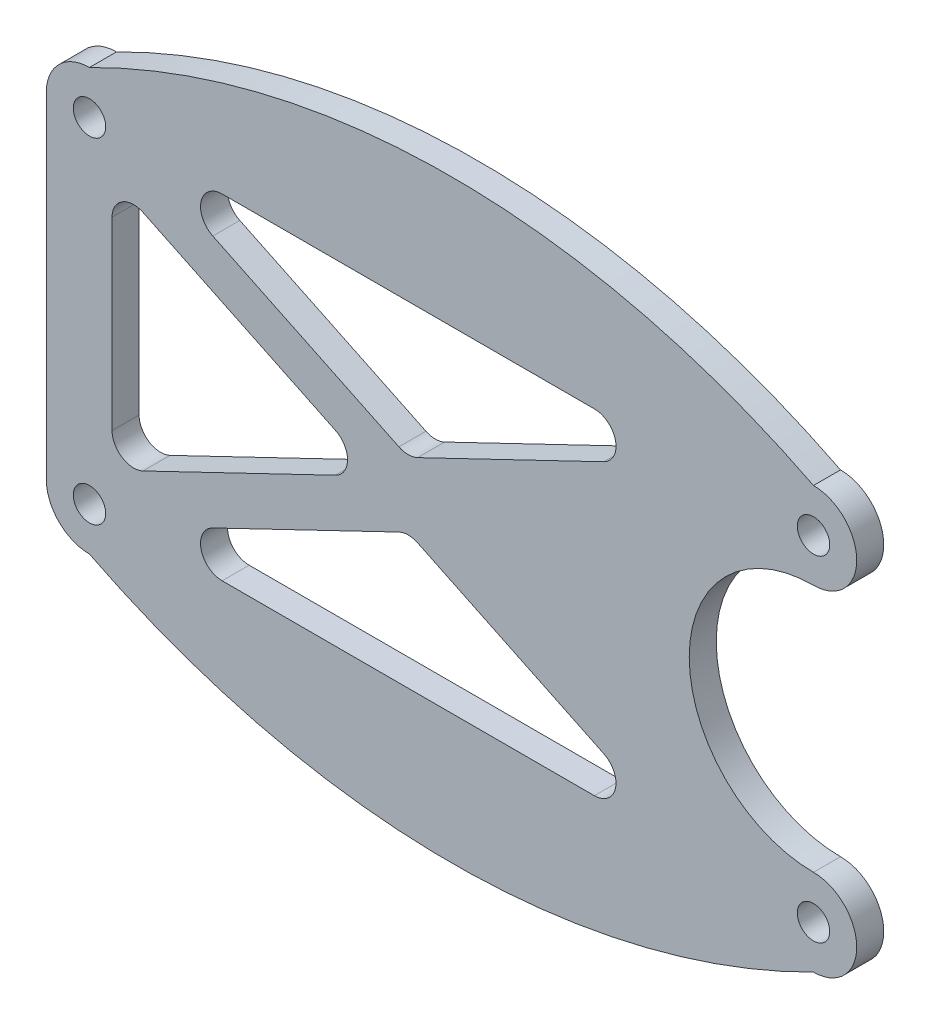
ISO-10303-21;
HEADER;
FILE_DESCRIPTION(('STEP AP214'),'2;1');
FILE_NAME('part.step','',(''),(''),'','','');
FILE_SCHEMA(('AUTOMOTIVE_DESIGN { 1 0 10303 214 1 1 1 1 }'));
ENDSEC;
DATA;
#1=APPLICATION_CONTEXT('core data for automotive mechanical design processes');
#2=APPLICATION_PROTOCOL_DEFINITION('international standard','automotive_design',2000,#1);
#3=PRODUCT_CONTEXT('',#1,'mechanical');
#4=PRODUCT('Part','Part','',(#3));
#5=PRODUCT_RELATED_PRODUCT_CATEGORY('part','',(#4));
#6=PRODUCT_DEFINITION_FORMATION('','',#4);
#7=PRODUCT_DEFINITION_CONTEXT('part definition',#1,'design');
#8=PRODUCT_DEFINITION('design','',#6,#7);
#9=PRODUCT_DEFINITION_SHAPE('','',#8);
#10=(LENGTH_UNIT() NAMED_UNIT(*) SI_UNIT(.MILLI.,.METRE.));
#11=(NAMED_UNIT(*) PLANE_ANGLE_UNIT() SI_UNIT($,.RADIAN.));
#12=(NAMED_UNIT(*) SI_UNIT($,.STERADIAN.) SOLID_ANGLE_UNIT());
#13=UNCERTAINTY_MEASURE_WITH_UNIT(LENGTH_MEASURE(1.E-05),#10,'distance_accuracy_value','');
#14=(GEOMETRIC_REPRESENTATION_CONTEXT(3) GLOBAL_UNCERTAINTY_ASSIGNED_CONTEXT((#13)) GLOBAL_UNIT_ASSIGNED_CONTEXT((#10,
#11,#12)) REPRESENTATION_CONTEXT('',''));
#15=CARTESIAN_POINT('',(0.,0.,0.));
#16=DIRECTION('',(0.,0.,1.));
#17=DIRECTION('',(1.,0.,0.));
#18=AXIS2_PLACEMENT_3D('',#15,#16,#17);
#19=CARTESIAN_POINT('',(-97.318076,15.5,2.5));
#20=DIRECTION('',(0.,0.,1.));
#21=DIRECTION('',(1.,0.,0.));
#22=AXIS2_PLACEMENT_3D('',#19,#20,#21);
#23=PLANE('',#22);
#24=DIRECTION('',(-0.901252424525187,0.433294434867877,0.));
#25=VECTOR('',#24,1.);
#26=CARTESIAN_POINT('',(-67.818076,-3.,2.5));
#27=LINE('',#26,#25);
#28=CARTESIAN_POINT('',(-49.7272860860248,-11.6974951509496,2.5));
#29=VERTEX_POINT('',#28);
#30=CARTESIAN_POINT('',(-66.9514871302643,-3.41662926429604,2.5));
#31=VERTEX_POINT('',#30);
#32=EDGE_CURVE('E360',#29,#31,#27,.T.);
#33=ORIENTED_EDGE('',*,*,#32,.F.);
#34=CARTESIAN_POINT('',(-50.5938749557605,-13.5,2.5));
#35=DIRECTION('',(0.,0.,1.));
#36=DIRECTION('',(1.,0.,0.));
#37=AXIS2_PLACEMENT_3D('',#34,#35,#36);
#38=CIRCLE('',#37,2.);
#39=CARTESIAN_POINT('',(-50.5938749557605,-15.5,2.5));
#40=VERTEX_POINT('',#39);
#41=EDGE_CURVE('E325',#29,#40,#38,.F.);
#42=ORIENTED_EDGE('',*,*,#41,.T.);
#43=DIRECTION('',(1.,0.,0.));
#44=VECTOR('',#43,1.);
#45=CARTESIAN_POINT('',(-41.818076,-15.5,2.5));
#46=LINE('',#45,#44);
#47=CARTESIAN_POINT('',(-85.0422770442395,-15.5,2.5));
#48=VERTEX_POINT('',#47);
#49=EDGE_CURVE('E378',#48,#40,#46,.T.);
#50=ORIENTED_EDGE('',*,*,#49,.F.);
#51=CARTESIAN_POINT('',(-85.0422770442395,-13.5,2.5));
#52=DIRECTION('',(0.,0.,1.));
#53=DIRECTION('',(1.,0.,0.));
#54=AXIS2_PLACEMENT_3D('',#51,#52,#53);
#55=CIRCLE('',#54,2.);
#56=CARTESIAN_POINT('',(-85.9088659139752,-11.6974951509496,2.5));
#57=VERTEX_POINT('',#56);
#58=EDGE_CURVE('E309',#48,#57,#55,.F.);
#59=ORIENTED_EDGE('',*,*,#58,.T.);
#60=DIRECTION('',(-0.901252424525186,-0.433294434867878,0.));
#61=VECTOR('',#60,1.);
#62=CARTESIAN_POINT('',(-67.818076,-3.,2.5));
#63=LINE('',#62,#61);
#64=CARTESIAN_POINT('',(-68.6846648697358,-3.41662926429604,2.5));
#65=VERTEX_POINT('',#64);
#66=EDGE_CURVE('E364',#65,#57,#63,.T.);
#67=ORIENTED_EDGE('',*,*,#66,.F.);
#68=CARTESIAN_POINT('',(-67.818076,-5.21913411334641,2.5));
#69=DIRECTION('',(0.,0.,1.));
#70=DIRECTION('',(1.,0.,0.));
#71=AXIS2_PLACEMENT_3D('',#68,#69,#70);
#72=CIRCLE('',#71,2.);
#73=EDGE_CURVE('E321',#65,#31,#72,.F.);
#74=ORIENTED_EDGE('',*,*,#73,.T.);
#75=EDGE_LOOP('',(#33,#42,#50,#59,#67,#74));
#76=FACE_BOUND('',#75,.T.);
#77=DIRECTION('',(0.901252424525186,0.433294434867877,0.));
#78=VECTOR('',#77,1.);
#79=CARTESIAN_POINT('',(-70.818076,0.,2.5));
#80=LINE('',#79,#78);
#81=CARTESIAN_POINT('',(-92.3621095991763,-10.3577084611424,2.5));
#82=VERTEX_POINT('',#81);
#83=CARTESIAN_POINT('',(-74.5672860860248,-1.80250484905037,2.5));
#84=VERTEX_POINT('',#83);
#85=EDGE_CURVE('E355',#82,#84,#80,.T.);
#86=ORIENTED_EDGE('',*,*,#85,.F.);
#87=CARTESIAN_POINT('',(-93.228698468912,-8.55520361209206,2.5));
#88=DIRECTION('',(0.,0.,1.));
#89=DIRECTION('',(1.,0.,0.));
#90=AXIS2_PLACEMENT_3D('',#87,#88,#89);
#91=CIRCLE('',#90,2.);
#92=CARTESIAN_POINT('',(-95.228698468912,-8.55520361209205,2.5));
#93=VERTEX_POINT('',#92);
#94=EDGE_CURVE('E337',#82,#93,#91,.F.);
#95=ORIENTED_EDGE('',*,*,#94,.T.);
#96=DIRECTION('',(0.,-1.,0.));
#97=VECTOR('',#96,1.);
#98=CARTESIAN_POINT('',(-95.228698468912,11.7358761869769,2.5));
#99=LINE('',#98,#97);
#100=CARTESIAN_POINT('',(-95.228698468912,8.55520361209205,2.5));
#101=VERTEX_POINT('',#100);
#102=EDGE_CURVE('E347',#101,#93,#99,.T.);
#103=ORIENTED_EDGE('',*,*,#102,.F.);
#104=CARTESIAN_POINT('',(-93.228698468912,8.55520361209205,2.5));
#105=DIRECTION('',(0.,0.,1.));
#106=DIRECTION('',(1.,0.,0.));
#107=AXIS2_PLACEMENT_3D('',#104,#105,#106);
#108=CIRCLE('',#107,2.);
#109=CARTESIAN_POINT('',(-92.3621095991763,10.3577084611424,2.5));
#110=VERTEX_POINT('',#109);
#111=EDGE_CURVE('E43',#101,#110,#108,.F.);
#112=ORIENTED_EDGE('',*,*,#111,.T.);
#113=DIRECTION('',(-0.901252424525186,0.433294434867877,0.));
#114=VECTOR('',#113,1.);
#115=CARTESIAN_POINT('',(-70.818076,0.,2.5));
#116=LINE('',#115,#114);
#117=CARTESIAN_POINT('',(-74.5672860860248,1.80250484905037,2.5));
#118=VERTEX_POINT('',#117);
#119=EDGE_CURVE('E346',#118,#110,#116,.T.);
#120=ORIENTED_EDGE('',*,*,#119,.F.);
#121=CARTESIAN_POINT('',(-75.4338749557605,0.,2.5));
#122=DIRECTION('',(0.,0.,1.));
#123=DIRECTION('',(1.,0.,0.));
#124=AXIS2_PLACEMENT_3D('',#121,#122,#123);
#125=CIRCLE('',#124,2.);
#126=EDGE_CURVE('E333',#118,#84,#125,.F.);
#127=ORIENTED_EDGE('',*,*,#126,.T.);
#128=EDGE_LOOP('',(#86,#95,#103,#112,#120,#127));
#129=FACE_BOUND('',#128,.T.);
#130=DIRECTION('',(0.901252424525186,-0.433294434867878,0.));
#131=VECTOR('',#130,1.);
#132=CARTESIAN_POINT('',(-67.818076,3.,2.5));
#133=LINE('',#132,#131);
#134=CARTESIAN_POINT('',(-85.9088659139752,11.6974951509496,2.5));
#135=VERTEX_POINT('',#134);
#136=CARTESIAN_POINT('',(-68.6846648697358,3.41662926429604,2.5));
#137=VERTEX_POINT('',#136);
#138=EDGE_CURVE('E383',#135,#137,#133,.T.);
#139=ORIENTED_EDGE('',*,*,#138,.F.);
#140=CARTESIAN_POINT('',(-85.0422770442395,13.5,2.5));
#141=DIRECTION('',(0.,0.,1.));
#142=DIRECTION('',(1.,0.,0.));
#143=AXIS2_PLACEMENT_3D('',#140,#141,#142);
#144=CIRCLE('',#143,2.);
#145=CARTESIAN_POINT('',(-85.0422770442395,15.5,2.5));
#146=VERTEX_POINT('',#145);
#147=EDGE_CURVE('E313',#135,#146,#144,.F.);
#148=ORIENTED_EDGE('',*,*,#147,.T.);
#149=DIRECTION('',(-1.,0.,0.));
#150=VECTOR('',#149,1.);
#151=CARTESIAN_POINT('',(-41.818076,15.5,2.5));
#152=LINE('',#151,#150);
#153=CARTESIAN_POINT('',(-50.5938749557605,15.5,2.5));
#154=VERTEX_POINT('',#153);
#155=EDGE_CURVE('E393',#154,#146,#152,.T.);
#156=ORIENTED_EDGE('',*,*,#155,.F.);
#157=CARTESIAN_POINT('',(-50.5938749557605,13.5,2.5));
#158=DIRECTION('',(0.,0.,1.));
#159=DIRECTION('',(1.,0.,0.));
#160=AXIS2_PLACEMENT_3D('',#157,#158,#159);
#161=CIRCLE('',#160,2.);
#162=CARTESIAN_POINT('',(-49.7272860860248,11.6974951509496,2.5));
#163=VERTEX_POINT('',#162);
#164=EDGE_CURVE('E329',#154,#163,#161,.F.);
#165=ORIENTED_EDGE('',*,*,#164,.T.);
#166=DIRECTION('',(0.901252424525186,0.433294434867878,0.));
#167=VECTOR('',#166,1.);
#168=CARTESIAN_POINT('',(-67.818076,3.,2.5));
#169=LINE('',#168,#167);
#170=CARTESIAN_POINT('',(-66.9514871302643,3.41662926429604,2.5));
#171=VERTEX_POINT('',#170);
#172=EDGE_CURVE('E402',#171,#163,#169,.T.);
#173=ORIENTED_EDGE('',*,*,#172,.F.);
#174=CARTESIAN_POINT('',(-67.818076,5.21913411334641,2.5));
#175=DIRECTION('',(0.,0.,1.));
#176=DIRECTION('',(1.,0.,0.));
#177=AXIS2_PLACEMENT_3D('',#174,#175,#176);
#178=CIRCLE('',#177,2.);
#179=EDGE_CURVE('E317',#171,#137,#178,.F.);
#180=ORIENTED_EDGE('',*,*,#179,.T.);
#181=EDGE_LOOP('',(#139,#148,#156,#165,#173,#180));
#182=FACE_BOUND('',#181,.T.);
#183=CARTESIAN_POINT('',(-30.318076,-15.5,2.5));
#184=DIRECTION('',(0.,0.,1.));
#185=DIRECTION('',(1.,0.,0.));
#186=AXIS2_PLACEMENT_3D('',#183,#184,#185);
#187=CIRCLE('',#186,1.5);
#188=CARTESIAN_POINT('',(-28.818076,-15.5,2.5));
#189=VERTEX_POINT('',#188);
#190=EDGE_CURVE('E413',#189,#189,#187,.T.);
#191=ORIENTED_EDGE('',*,*,#190,.F.);
#192=EDGE_LOOP('',(#191));
#193=FACE_BOUND('',#192,.T.);
#194=CARTESIAN_POINT('',(-97.318076,15.5,2.5));
#195=DIRECTION('',(0.,0.,1.));
#196=DIRECTION('',(1.,0.,0.));
#197=AXIS2_PLACEMENT_3D('',#194,#195,#196);
#198=CIRCLE('',#197,1.50000000000001);
#199=CARTESIAN_POINT('',(-95.818076,15.5,2.5));
#200=VERTEX_POINT('',#199);
#201=EDGE_CURVE('E425',#200,#200,#198,.T.);
#202=ORIENTED_EDGE('',*,*,#201,.F.);
#203=EDGE_LOOP('',(#202));
#204=FACE_BOUND('',#203,.T.);
#205=CARTESIAN_POINT('',(-97.318076,15.5,2.5));
#206=DIRECTION('',(0.,0.,1.));
#207=DIRECTION('',(1.,0.,0.));
#208=AXIS2_PLACEMENT_3D('',#205,#206,#207);
#209=CIRCLE('',#208,4.);
#210=CARTESIAN_POINT('',(-97.318076,19.5,2.5));
#211=VERTEX_POINT('',#210);
#212=CARTESIAN_POINT('',(-101.318076,15.5,2.5));
#213=VERTEX_POINT('',#212);
#214=EDGE_CURVE('E247',#211,#213,#209,.T.);
#215=ORIENTED_EDGE('',*,*,#214,.T.);
#216=DIRECTION('',(0.,-1.,0.));
#217=VECTOR('',#216,1.);
#218=CARTESIAN_POINT('',(-101.318076,15.5,2.5));
#219=LINE('',#218,#217);
#220=CARTESIAN_POINT('',(-101.318076,-15.5,2.5));
#221=VERTEX_POINT('',#220);
#222=EDGE_CURVE('E432',#213,#221,#219,.T.);
#223=ORIENTED_EDGE('',*,*,#222,.T.);
#224=CARTESIAN_POINT('',(-97.318076,-15.5,2.5));
#225=DIRECTION('',(0.,0.,1.));
#226=DIRECTION('',(-1.,0.,0.));
#227=AXIS2_PLACEMENT_3D('',#224,#225,#226);
#228=CIRCLE('',#227,4.);
#229=CARTESIAN_POINT('',(-97.318076,-19.5,2.5));
#230=VERTEX_POINT('',#229);
#231=EDGE_CURVE('E434',#221,#230,#228,.T.);
#232=ORIENTED_EDGE('',*,*,#231,.T.);
#233=CARTESIAN_POINT('',(-63.818076,46.640625,2.5));
#234=DIRECTION('',(0.,0.,1.));
#235=DIRECTION('',(1.,0.,0.));
#236=AXIS2_PLACEMENT_3D('',#233,#234,#235);
#237=CIRCLE('',#236,74.140625);
#238=CARTESIAN_POINT('',(-30.318076,-19.5,2.5));
#239=VERTEX_POINT('',#238);
#240=EDGE_CURVE('E213',#230,#239,#237,.T.);
#241=ORIENTED_EDGE('',*,*,#240,.T.);
#242=CARTESIAN_POINT('',(-30.318076,-15.5,2.5));
#243=DIRECTION('',(0.,0.,1.));
#244=DIRECTION('',(-1.,0.,0.));
#245=AXIS2_PLACEMENT_3D('',#242,#243,#244);
#246=CIRCLE('',#245,4.);
#247=CARTESIAN_POINT('',(-30.318076,-11.5,2.5));
#248=VERTEX_POINT('',#247);
#249=EDGE_CURVE('E436',#239,#248,#246,.T.);
#250=ORIENTED_EDGE('',*,*,#249,.T.);
#251=CARTESIAN_POINT('',(-30.318076,0.,2.5));
#252=DIRECTION('',(0.,0.,-1.));
#253=DIRECTION('',(1.,0.,0.));
#254=AXIS2_PLACEMENT_3D('',#251,#252,#253);
#255=CIRCLE('',#254,11.5);
#256=CARTESIAN_POINT('',(-30.318076,11.5,2.5));
#257=VERTEX_POINT('',#256);
#258=EDGE_CURVE('E438',#248,#257,#255,.T.);
#259=ORIENTED_EDGE('',*,*,#258,.T.);
#260=CARTESIAN_POINT('',(-30.318076,15.5,2.5));
#261=DIRECTION('',(0.,0.,1.));
#262=DIRECTION('',(1.,0.,0.));
#263=AXIS2_PLACEMENT_3D('',#260,#261,#262);
#264=CIRCLE('',#263,4.);
#265=CARTESIAN_POINT('',(-30.318076,19.5,2.5));
#266=VERTEX_POINT('',#265);
#267=EDGE_CURVE('E252',#257,#266,#264,.T.);
#268=ORIENTED_EDGE('',*,*,#267,.T.);
#269=CARTESIAN_POINT('',(-63.818076,-46.640625,2.5));
#270=DIRECTION('',(0.,0.,1.));
#271=DIRECTION('',(-1.,0.,0.));
#272=AXIS2_PLACEMENT_3D('',#269,#270,#271);
#273=CIRCLE('',#272,74.140625);
#274=EDGE_CURVE('E230',#266,#211,#273,.T.);
#275=ORIENTED_EDGE('',*,*,#274,.T.);
#276=EDGE_LOOP('',(#215,#223,#232,#241,#250,#259,#268,#275));
#277=FACE_BOUND('',#276,.T.);
#278=CARTESIAN_POINT('',(-30.318076,15.5,2.5));
#279=DIRECTION('',(0.,0.,1.));
#280=DIRECTION('',(1.,0.,0.));
#281=AXIS2_PLACEMENT_3D('',#278,#279,#280);
#282=CIRCLE('',#281,1.5);
#283=CARTESIAN_POINT('',(-28.818076,15.5,2.5));
#284=VERTEX_POINT('',#283);
#285=EDGE_CURVE('E419',#284,#284,#282,.T.);
#286=ORIENTED_EDGE('',*,*,#285,.F.);
#287=EDGE_LOOP('',(#286));
#288=FACE_BOUND('',#287,.T.);
#289=CARTESIAN_POINT('',(-97.318076,-15.5,2.5));
#290=DIRECTION('',(0.,0.,1.));
#291=DIRECTION('',(1.,0.,0.));
#292=AXIS2_PLACEMENT_3D('',#289,#290,#291);
#293=CIRCLE('',#292,1.50000000000001);
#294=CARTESIAN_POINT('',(-95.818076,-15.5,2.5));
#295=VERTEX_POINT('',#294);
#296=EDGE_CURVE('E407',#295,#295,#293,.T.);
#297=ORIENTED_EDGE('',*,*,#296,.F.);
#298=EDGE_LOOP('',(#297));
#299=FACE_BOUND('',#298,.T.);
#300=ADVANCED_FACE('F35',(#76,#129,#182,#193,#204,#277,#288,#299),#23,.T.);
#301=CARTESIAN_POINT('',(-97.318076,15.5,0.));
#302=DIRECTION('',(0.,0.,1.));
#303=DIRECTION('',(1.,0.,0.));
#304=AXIS2_PLACEMENT_3D('',#301,#302,#303);
#305=PLANE('',#304);
#306=DIRECTION('',(-0.901252424525186,-0.433294434867878,0.));
#307=VECTOR('',#306,1.);
#308=CARTESIAN_POINT('',(-67.818076,-3.,0.));
#309=LINE('',#308,#307);
#310=CARTESIAN_POINT('',(-68.6846648697358,-3.41662926429604,0.));
#311=VERTEX_POINT('',#310);
#312=CARTESIAN_POINT('',(-85.9088659139752,-11.6974951509496,0.));
#313=VERTEX_POINT('',#312);
#314=EDGE_CURVE('E377',#311,#313,#309,.T.);
#315=ORIENTED_EDGE('',*,*,#314,.T.);
#316=CARTESIAN_POINT('',(-85.0422770442395,-13.5,0.));
#317=DIRECTION('',(0.,0.,1.));
#318=DIRECTION('',(1.,0.,0.));
#319=AXIS2_PLACEMENT_3D('',#316,#317,#318);
#320=CIRCLE('',#319,2.);
#321=CARTESIAN_POINT('',(-85.0422770442395,-15.5,0.));
#322=VERTEX_POINT('',#321);
#323=EDGE_CURVE('E311',#313,#322,#320,.T.);
#324=ORIENTED_EDGE('',*,*,#323,.T.);
#325=DIRECTION('',(1.,0.,0.));
#326=VECTOR('',#325,1.);
#327=CARTESIAN_POINT('',(-41.818076,-15.5,0.));
#328=LINE('',#327,#326);
#329=CARTESIAN_POINT('',(-50.5938749557605,-15.5,0.));
#330=VERTEX_POINT('',#329);
#331=EDGE_CURVE('E381',#322,#330,#328,.T.);
#332=ORIENTED_EDGE('',*,*,#331,.T.);
#333=CARTESIAN_POINT('',(-50.5938749557605,-13.5,0.));
#334=DIRECTION('',(0.,0.,1.));
#335=DIRECTION('',(1.,0.,0.));
#336=AXIS2_PLACEMENT_3D('',#333,#334,#335);
#337=CIRCLE('',#336,2.);
#338=CARTESIAN_POINT('',(-49.7272860860248,-11.6974951509496,0.));
#339=VERTEX_POINT('',#338);
#340=EDGE_CURVE('E327',#330,#339,#337,.T.);
#341=ORIENTED_EDGE('',*,*,#340,.T.);
#342=DIRECTION('',(-0.901252424525187,0.433294434867877,0.));
#343=VECTOR('',#342,1.);
#344=CARTESIAN_POINT('',(-67.818076,-3.,0.));
#345=LINE('',#344,#343);
#346=CARTESIAN_POINT('',(-66.9514871302643,-3.41662926429604,0.));
#347=VERTEX_POINT('',#346);
#348=EDGE_CURVE('E374',#339,#347,#345,.T.);
#349=ORIENTED_EDGE('',*,*,#348,.T.);
#350=CARTESIAN_POINT('',(-67.818076,-5.21913411334641,0.));
#351=DIRECTION('',(0.,0.,1.));
#352=DIRECTION('',(1.,0.,0.));
#353=AXIS2_PLACEMENT_3D('',#350,#351,#352);
#354=CIRCLE('',#353,2.);
#355=EDGE_CURVE('E323',#347,#311,#354,.T.);
#356=ORIENTED_EDGE('',*,*,#355,.T.);
#357=EDGE_LOOP('',(#315,#324,#332,#341,#349,#356));
#358=FACE_BOUND('',#357,.T.);
#359=DIRECTION('',(-0.901252424525186,0.433294434867877,0.));
#360=VECTOR('',#359,1.);
#361=CARTESIAN_POINT('',(-70.818076,0.,0.));
#362=LINE('',#361,#360);
#363=CARTESIAN_POINT('',(-74.5672860860248,1.80250484905037,0.));
#364=VERTEX_POINT('',#363);
#365=CARTESIAN_POINT('',(-92.3621095991763,10.3577084611424,0.));
#366=VERTEX_POINT('',#365);
#367=EDGE_CURVE('E361',#364,#366,#362,.T.);
#368=ORIENTED_EDGE('',*,*,#367,.T.);
#369=CARTESIAN_POINT('',(-93.228698468912,8.55520361209205,0.));
#370=DIRECTION('',(0.,0.,1.));
#371=DIRECTION('',(1.,0.,0.));
#372=AXIS2_PLACEMENT_3D('',#369,#370,#371);
#373=CIRCLE('',#372,2.);
#374=CARTESIAN_POINT('',(-95.228698468912,8.55520361209205,0.));
#375=VERTEX_POINT('',#374);
#376=EDGE_CURVE('E11',#366,#375,#373,.T.);
#377=ORIENTED_EDGE('',*,*,#376,.T.);
#378=DIRECTION('',(0.,-1.,0.));
#379=VECTOR('',#378,1.);
#380=CARTESIAN_POINT('',(-95.228698468912,11.7358761869769,0.));
#381=LINE('',#380,#379);
#382=CARTESIAN_POINT('',(-95.228698468912,-8.55520361209205,0.));
#383=VERTEX_POINT('',#382);
#384=EDGE_CURVE('E358',#375,#383,#381,.T.);
#385=ORIENTED_EDGE('',*,*,#384,.T.);
#386=CARTESIAN_POINT('',(-93.228698468912,-8.55520361209206,0.));
#387=DIRECTION('',(0.,0.,1.));
#388=DIRECTION('',(1.,0.,0.));
#389=AXIS2_PLACEMENT_3D('',#386,#387,#388);
#390=CIRCLE('',#389,2.);
#391=CARTESIAN_POINT('',(-92.3621095991763,-10.3577084611424,0.));
#392=VERTEX_POINT('',#391);
#393=EDGE_CURVE('E339',#383,#392,#390,.T.);
#394=ORIENTED_EDGE('',*,*,#393,.T.);
#395=DIRECTION('',(0.901252424525186,0.433294434867877,0.));
#396=VECTOR('',#395,1.);
#397=CARTESIAN_POINT('',(-70.818076,0.,0.));
#398=LINE('',#397,#396);
#399=CARTESIAN_POINT('',(-74.5672860860248,-1.80250484905037,0.));
#400=VERTEX_POINT('',#399);
#401=EDGE_CURVE('E366',#392,#400,#398,.T.);
#402=ORIENTED_EDGE('',*,*,#401,.T.);
#403=CARTESIAN_POINT('',(-75.4338749557605,0.,0.));
#404=DIRECTION('',(0.,0.,1.));
#405=DIRECTION('',(1.,0.,0.));
#406=AXIS2_PLACEMENT_3D('',#403,#404,#405);
#407=CIRCLE('',#406,2.);
#408=EDGE_CURVE('E335',#400,#364,#407,.T.);
#409=ORIENTED_EDGE('',*,*,#408,.T.);
#410=EDGE_LOOP('',(#368,#377,#385,#394,#402,#409));
#411=FACE_BOUND('',#410,.T.);
#412=DIRECTION('',(0.901252424525186,0.433294434867878,0.));
#413=VECTOR('',#412,1.);
#414=CARTESIAN_POINT('',(-67.818076,3.,0.));
#415=LINE('',#414,#413);
#416=CARTESIAN_POINT('',(-66.9514871302643,3.41662926429604,0.));
#417=VERTEX_POINT('',#416);
#418=CARTESIAN_POINT('',(-49.7272860860248,11.6974951509496,0.));
#419=VERTEX_POINT('',#418);
#420=EDGE_CURVE('E392',#417,#419,#415,.T.);
#421=ORIENTED_EDGE('',*,*,#420,.T.);
#422=CARTESIAN_POINT('',(-50.5938749557605,13.5,0.));
#423=DIRECTION('',(0.,0.,1.));
#424=DIRECTION('',(1.,0.,0.));
#425=AXIS2_PLACEMENT_3D('',#422,#423,#424);
#426=CIRCLE('',#425,2.);
#427=CARTESIAN_POINT('',(-50.5938749557605,15.5,0.));
#428=VERTEX_POINT('',#427);
#429=EDGE_CURVE('E331',#419,#428,#426,.T.);
#430=ORIENTED_EDGE('',*,*,#429,.T.);
#431=DIRECTION('',(-1.,0.,0.));
#432=VECTOR('',#431,1.);
#433=CARTESIAN_POINT('',(-41.818076,15.5,0.));
#434=LINE('',#433,#432);
#435=CARTESIAN_POINT('',(-85.0422770442395,15.5,0.));
#436=VERTEX_POINT('',#435);
#437=EDGE_CURVE('E396',#428,#436,#434,.T.);
#438=ORIENTED_EDGE('',*,*,#437,.T.);
#439=CARTESIAN_POINT('',(-85.0422770442395,13.5,0.));
#440=DIRECTION('',(0.,0.,1.));
#441=DIRECTION('',(1.,0.,0.));
#442=AXIS2_PLACEMENT_3D('',#439,#440,#441);
#443=CIRCLE('',#442,2.);
#444=CARTESIAN_POINT('',(-85.9088659139752,11.6974951509496,0.));
#445=VERTEX_POINT('',#444);
#446=EDGE_CURVE('E315',#436,#445,#443,.T.);
#447=ORIENTED_EDGE('',*,*,#446,.T.);
#448=DIRECTION('',(0.901252424525186,-0.433294434867878,0.));
#449=VECTOR('',#448,1.);
#450=CARTESIAN_POINT('',(-67.818076,3.,0.));
#451=LINE('',#450,#449);
#452=CARTESIAN_POINT('',(-68.6846648697358,3.41662926429604,0.));
#453=VERTEX_POINT('',#452);
#454=EDGE_CURVE('E389',#445,#453,#451,.T.);
#455=ORIENTED_EDGE('',*,*,#454,.T.);
#456=CARTESIAN_POINT('',(-67.818076,5.21913411334641,0.));
#457=DIRECTION('',(0.,0.,1.));
#458=DIRECTION('',(1.,0.,0.));
#459=AXIS2_PLACEMENT_3D('',#456,#457,#458);
#460=CIRCLE('',#459,2.);
#461=EDGE_CURVE('E319',#453,#417,#460,.T.);
#462=ORIENTED_EDGE('',*,*,#461,.T.);
#463=EDGE_LOOP('',(#421,#430,#438,#447,#455,#462));
#464=FACE_BOUND('',#463,.T.);
#465=CARTESIAN_POINT('',(-97.318076,15.5,0.));
#466=DIRECTION('',(0.,0.,1.));
#467=DIRECTION('',(1.,0.,0.));
#468=AXIS2_PLACEMENT_3D('',#465,#466,#467);
#469=CIRCLE('',#468,4.);
#470=CARTESIAN_POINT('',(-97.318076,19.5,0.));
#471=VERTEX_POINT('',#470);
#472=CARTESIAN_POINT('',(-101.318076,15.5,0.));
#473=VERTEX_POINT('',#472);
#474=EDGE_CURVE('E239',#471,#473,#469,.T.);
#475=ORIENTED_EDGE('',*,*,#474,.F.);
#476=CARTESIAN_POINT('',(-63.818076,-46.640625,0.));
#477=DIRECTION('',(0.,0.,1.));
#478=DIRECTION('',(-1.,0.,0.));
#479=AXIS2_PLACEMENT_3D('',#476,#477,#478);
#480=CIRCLE('',#479,74.140625);
#481=CARTESIAN_POINT('',(-30.318076,19.5,0.));
#482=VERTEX_POINT('',#481);
#483=EDGE_CURVE('E371',#482,#471,#480,.T.);
#484=ORIENTED_EDGE('',*,*,#483,.F.);
#485=CARTESIAN_POINT('',(-30.318076,15.5,0.));
#486=DIRECTION('',(0.,0.,1.));
#487=DIRECTION('',(1.,0.,0.));
#488=AXIS2_PLACEMENT_3D('',#485,#486,#487);
#489=CIRCLE('',#488,4.);
#490=CARTESIAN_POINT('',(-30.318076,11.5,0.));
#491=VERTEX_POINT('',#490);
#492=EDGE_CURVE('E244',#491,#482,#489,.T.);
#493=ORIENTED_EDGE('',*,*,#492,.F.);
#494=CARTESIAN_POINT('',(-30.318076,0.,0.));
#495=DIRECTION('',(0.,0.,-1.));
#496=DIRECTION('',(1.,0.,0.));
#497=AXIS2_PLACEMENT_3D('',#494,#495,#496);
#498=CIRCLE('',#497,11.5);
#499=CARTESIAN_POINT('',(-30.318076,-11.5,0.));
#500=VERTEX_POINT('',#499);
#501=EDGE_CURVE('E237',#500,#491,#498,.T.);
#502=ORIENTED_EDGE('',*,*,#501,.F.);
#503=CARTESIAN_POINT('',(-30.318076,-15.5,0.));
#504=DIRECTION('',(0.,0.,1.));
#505=DIRECTION('',(-1.,0.,0.));
#506=AXIS2_PLACEMENT_3D('',#503,#504,#505);
#507=CIRCLE('',#506,4.);
#508=CARTESIAN_POINT('',(-30.318076,-19.5,0.));
#509=VERTEX_POINT('',#508);
#510=EDGE_CURVE('E229',#509,#500,#507,.T.);
#511=ORIENTED_EDGE('',*,*,#510,.F.);
#512=CARTESIAN_POINT('',(-63.818076,46.640625,0.));
#513=DIRECTION('',(0.,0.,1.));
#514=DIRECTION('',(1.,0.,0.));
#515=AXIS2_PLACEMENT_3D('',#512,#513,#514);
#516=CIRCLE('',#515,74.140625);
#517=CARTESIAN_POINT('',(-97.318076,-19.5,0.));
#518=VERTEX_POINT('',#517);
#519=EDGE_CURVE('E210',#518,#509,#516,.T.);
#520=ORIENTED_EDGE('',*,*,#519,.F.);
#521=CARTESIAN_POINT('',(-97.318076,-15.5,0.));
#522=DIRECTION('',(0.,0.,1.));
#523=DIRECTION('',(-1.,0.,0.));
#524=AXIS2_PLACEMENT_3D('',#521,#522,#523);
#525=CIRCLE('',#524,4.);
#526=CARTESIAN_POINT('',(-101.318076,-15.5,0.));
#527=VERTEX_POINT('',#526);
#528=EDGE_CURVE('E227',#527,#518,#525,.T.);
#529=ORIENTED_EDGE('',*,*,#528,.F.);
#530=DIRECTION('',(0.,-1.,0.));
#531=VECTOR('',#530,1.);
#532=CARTESIAN_POINT('',(-101.318076,15.5,0.));
#533=LINE('',#532,#531);
#534=EDGE_CURVE('E235',#473,#527,#533,.T.);
#535=ORIENTED_EDGE('',*,*,#534,.F.);
#536=EDGE_LOOP('',(#475,#484,#493,#502,#511,#520,#529,#535));
#537=FACE_BOUND('',#536,.T.);
#538=CARTESIAN_POINT('',(-97.318076,15.5,0.));
#539=DIRECTION('',(0.,0.,1.));
#540=DIRECTION('',(1.,0.,0.));
#541=AXIS2_PLACEMENT_3D('',#538,#539,#540);
#542=CIRCLE('',#541,1.50000000000001);
#543=CARTESIAN_POINT('',(-95.818076,15.5,0.));
#544=VERTEX_POINT('',#543);
#545=EDGE_CURVE('E422',#544,#544,#542,.T.);
#546=ORIENTED_EDGE('',*,*,#545,.T.);
#547=EDGE_LOOP('',(#546));
#548=FACE_BOUND('',#547,.T.);
#549=CARTESIAN_POINT('',(-30.318076,15.5,0.));
#550=DIRECTION('',(0.,0.,1.));
#551=DIRECTION('',(1.,0.,0.));
#552=AXIS2_PLACEMENT_3D('',#549,#550,#551);
#553=CIRCLE('',#552,1.5);
#554=CARTESIAN_POINT('',(-28.818076,15.5,0.));
#555=VERTEX_POINT('',#554);
#556=EDGE_CURVE('E416',#555,#555,#553,.T.);
#557=ORIENTED_EDGE('',*,*,#556,.T.);
#558=EDGE_LOOP('',(#557));
#559=FACE_BOUND('',#558,.T.);
#560=CARTESIAN_POINT('',(-30.318076,-15.5,0.));
#561=DIRECTION('',(0.,0.,1.));
#562=DIRECTION('',(1.,0.,0.));
#563=AXIS2_PLACEMENT_3D('',#560,#561,#562);
#564=CIRCLE('',#563,1.5);
#565=CARTESIAN_POINT('',(-28.818076,-15.5,0.));
#566=VERTEX_POINT('',#565);
#567=EDGE_CURVE('E410',#566,#566,#564,.T.);
#568=ORIENTED_EDGE('',*,*,#567,.T.);
#569=EDGE_LOOP('',(#568));
#570=FACE_BOUND('',#569,.T.);
#571=CARTESIAN_POINT('',(-97.318076,-15.5,0.));
#572=DIRECTION('',(0.,0.,1.));
#573=DIRECTION('',(1.,0.,0.));
#574=AXIS2_PLACEMENT_3D('',#571,#572,#573);
#575=CIRCLE('',#574,1.50000000000001);
#576=CARTESIAN_POINT('',(-95.818076,-15.5,0.));
#577=VERTEX_POINT('',#576);
#578=EDGE_CURVE('E399',#577,#577,#575,.T.);
#579=ORIENTED_EDGE('',*,*,#578,.T.);
#580=EDGE_LOOP('',(#579));
#581=FACE_BOUND('',#580,.T.);
#582=ADVANCED_FACE('F225',(#358,#411,#464,#537,#548,#559,#570,#581),#305,.F.);
#583=CARTESIAN_POINT('',(-97.318076,15.5,2.5));
#584=DIRECTION('',(0.,0.,-1.));
#585=DIRECTION('',(-1.,0.,0.));
#586=AXIS2_PLACEMENT_3D('',#583,#584,#585);
#587=CYLINDRICAL_SURFACE('',#586,4.);
#588=ORIENTED_EDGE('',*,*,#474,.T.);
#589=DIRECTION('',(0.,0.,-1.));
#590=VECTOR('',#589,1.);
#591=CARTESIAN_POINT('',(-101.318076,15.5,2.5));
#592=LINE('',#591,#590);
#593=EDGE_CURVE('E262',#213,#473,#592,.T.);
#594=ORIENTED_EDGE('',*,*,#593,.F.);
#595=ORIENTED_EDGE('',*,*,#214,.F.);
#596=DIRECTION('',(0.,0.,-1.));
#597=VECTOR('',#596,1.);
#598=CARTESIAN_POINT('',(-97.318076,19.5,2.5));
#599=LINE('',#598,#597);
#600=EDGE_CURVE('E248',#211,#471,#599,.T.);
#601=ORIENTED_EDGE('',*,*,#600,.T.);
#602=EDGE_LOOP('',(#588,#594,#595,#601));
#603=FACE_BOUND('',#602,.T.);
#604=ADVANCED_FACE('F444',(#603),#587,.T.);
#605=CARTESIAN_POINT('',(-101.318076,15.5,2.5));
#606=DIRECTION('',(1.,0.,0.));
#607=DIRECTION('',(0.,0.,-1.));
#608=AXIS2_PLACEMENT_3D('',#605,#606,#607);
#609=PLANE('',#608);
#610=ORIENTED_EDGE('',*,*,#534,.T.);
#611=DIRECTION('',(0.,0.,-1.));
#612=VECTOR('',#611,1.);
#613=CARTESIAN_POINT('',(-101.318076,-15.5,2.5));
#614=LINE('',#613,#612);
#615=EDGE_CURVE('E218',#221,#527,#614,.T.);
#616=ORIENTED_EDGE('',*,*,#615,.F.);
#617=ORIENTED_EDGE('',*,*,#222,.F.);
#618=ORIENTED_EDGE('',*,*,#593,.T.);
#619=EDGE_LOOP('',(#610,#616,#617,#618));
#620=FACE_BOUND('',#619,.T.);
#621=ADVANCED_FACE('F450',(#620),#609,.F.);
#622=CARTESIAN_POINT('',(-97.318076,-15.5,2.5));
#623=DIRECTION('',(0.,0.,-1.));
#624=DIRECTION('',(-1.,0.,0.));
#625=AXIS2_PLACEMENT_3D('',#622,#623,#624);
#626=CYLINDRICAL_SURFACE('',#625,4.);
#627=ORIENTED_EDGE('',*,*,#528,.T.);
#628=DIRECTION('',(0.,0.,-1.));
#629=VECTOR('',#628,1.);
#630=CARTESIAN_POINT('',(-97.318076,-19.5,2.5));
#631=LINE('',#630,#629);
#632=EDGE_CURVE('E207',#230,#518,#631,.T.);
#633=ORIENTED_EDGE('',*,*,#632,.F.);
#634=ORIENTED_EDGE('',*,*,#231,.F.);
#635=ORIENTED_EDGE('',*,*,#615,.T.);
#636=EDGE_LOOP('',(#627,#633,#634,#635));
#637=FACE_BOUND('',#636,.T.);
#638=ADVANCED_FACE('F233',(#637),#626,.T.);
#639=CARTESIAN_POINT('',(-30.318076,-15.5,2.5));
#640=DIRECTION('',(0.,0.,-1.));
#641=DIRECTION('',(-1.,0.,0.));
#642=AXIS2_PLACEMENT_3D('',#639,#640,#641);
#643=CYLINDRICAL_SURFACE('',#642,4.);
#644=ORIENTED_EDGE('',*,*,#510,.T.);
#645=DIRECTION('',(0.,0.,-1.));
#646=VECTOR('',#645,1.);
#647=CARTESIAN_POINT('',(-30.318076,-11.5,2.5));
#648=LINE('',#647,#646);
#649=EDGE_CURVE('E257',#248,#500,#648,.T.);
#650=ORIENTED_EDGE('',*,*,#649,.F.);
#651=ORIENTED_EDGE('',*,*,#249,.F.);
#652=DIRECTION('',(0.,0.,-1.));
#653=VECTOR('',#652,1.);
#654=CARTESIAN_POINT('',(-30.318076,-19.5,2.5));
#655=LINE('',#654,#653);
#656=EDGE_CURVE('E219',#239,#509,#655,.T.);
#657=ORIENTED_EDGE('',*,*,#656,.T.);
#658=EDGE_LOOP('',(#644,#650,#651,#657));
#659=FACE_BOUND('',#658,.T.);
#660=ADVANCED_FACE('F499',(#659),#643,.T.);
#661=CARTESIAN_POINT('',(-30.318076,0.,2.5));
#662=DIRECTION('',(0.,0.,-1.));
#663=DIRECTION('',(-1.,0.,0.));
#664=AXIS2_PLACEMENT_3D('',#661,#662,#663);
#665=CYLINDRICAL_SURFACE('',#664,11.5);
#666=ORIENTED_EDGE('',*,*,#501,.T.);
#667=DIRECTION('',(0.,0.,-1.));
#668=VECTOR('',#667,1.);
#669=CARTESIAN_POINT('',(-30.318076,11.5,2.5));
#670=LINE('',#669,#668);
#671=EDGE_CURVE('E254',#257,#491,#670,.T.);
#672=ORIENTED_EDGE('',*,*,#671,.F.);
#673=ORIENTED_EDGE('',*,*,#258,.F.);
#674=ORIENTED_EDGE('',*,*,#649,.T.);
#675=EDGE_LOOP('',(#666,#672,#673,#674));
#676=FACE_BOUND('',#675,.T.);
#677=ADVANCED_FACE('F495',(#676),#665,.F.);
#678=CARTESIAN_POINT('',(-30.318076,15.5,2.5));
#679=DIRECTION('',(0.,0.,-1.));
#680=DIRECTION('',(-1.,0.,0.));
#681=AXIS2_PLACEMENT_3D('',#678,#679,#680);
#682=CYLINDRICAL_SURFACE('',#681,4.);
#683=ORIENTED_EDGE('',*,*,#492,.T.);
#684=DIRECTION('',(0.,0.,-1.));
#685=VECTOR('',#684,1.);
#686=CARTESIAN_POINT('',(-30.318076,19.5,2.5));
#687=LINE('',#686,#685);
#688=EDGE_CURVE('E251',#266,#482,#687,.T.);
#689=ORIENTED_EDGE('',*,*,#688,.F.);
#690=ORIENTED_EDGE('',*,*,#267,.F.);
#691=ORIENTED_EDGE('',*,*,#671,.T.);
#692=EDGE_LOOP('',(#683,#689,#690,#691));
#693=FACE_BOUND('',#692,.T.);
#694=ADVANCED_FACE('F492',(#693),#682,.T.);
#695=CARTESIAN_POINT('',(-97.318076,15.5,2.5));
#696=DIRECTION('',(0.,0.,-1.));
#697=DIRECTION('',(-1.,0.,0.));
#698=AXIS2_PLACEMENT_3D('',#695,#696,#697);
#699=CYLINDRICAL_SURFACE('',#698,1.50000000000001);
#700=ORIENTED_EDGE('',*,*,#201,.T.);
#701=EDGE_LOOP('',(#700));
#702=FACE_BOUND('',#701,.T.);
#703=ORIENTED_EDGE('',*,*,#545,.F.);
#704=EDGE_LOOP('',(#703));
#705=FACE_BOUND('',#704,.T.);
#706=ADVANCED_FACE('F489',(#702,#705),#699,.F.);
#707=CARTESIAN_POINT('',(-30.318076,15.5,2.5));
#708=DIRECTION('',(0.,0.,-1.));
#709=DIRECTION('',(-1.,0.,0.));
#710=AXIS2_PLACEMENT_3D('',#707,#708,#709);
#711=CYLINDRICAL_SURFACE('',#710,1.5);
#712=ORIENTED_EDGE('',*,*,#285,.T.);
#713=EDGE_LOOP('',(#712));
#714=FACE_BOUND('',#713,.T.);
#715=ORIENTED_EDGE('',*,*,#556,.F.);
#716=EDGE_LOOP('',(#715));
#717=FACE_BOUND('',#716,.T.);
#718=ADVANCED_FACE('F563',(#714,#717),#711,.F.);
#719=CARTESIAN_POINT('',(-30.318076,-15.5,2.5));
#720=DIRECTION('',(0.,0.,-1.));
#721=DIRECTION('',(-1.,0.,0.));
#722=AXIS2_PLACEMENT_3D('',#719,#720,#721);
#723=CYLINDRICAL_SURFACE('',#722,1.5);
#724=ORIENTED_EDGE('',*,*,#190,.T.);
#725=EDGE_LOOP('',(#724));
#726=FACE_BOUND('',#725,.T.);
#727=ORIENTED_EDGE('',*,*,#567,.F.);
#728=EDGE_LOOP('',(#727));
#729=FACE_BOUND('',#728,.T.);
#730=ADVANCED_FACE('F574',(#726,#729),#723,.F.);
#731=CARTESIAN_POINT('',(-97.318076,-15.5,2.5));
#732=DIRECTION('',(0.,0.,-1.));
#733=DIRECTION('',(-1.,0.,0.));
#734=AXIS2_PLACEMENT_3D('',#731,#732,#733);
#735=CYLINDRICAL_SURFACE('',#734,1.50000000000001);
#736=ORIENTED_EDGE('',*,*,#296,.T.);
#737=EDGE_LOOP('',(#736));
#738=FACE_BOUND('',#737,.T.);
#739=ORIENTED_EDGE('',*,*,#578,.F.);
#740=EDGE_LOOP('',(#739));
#741=FACE_BOUND('',#740,.T.);
#742=ADVANCED_FACE('F572',(#738,#741),#735,.F.);
#743=CARTESIAN_POINT('',(-67.818076,3.,0.));
#744=DIRECTION('',(-0.433294434867878,-0.901252424525186,0.));
#745=DIRECTION('',(0.901252424525186,-0.433294434867878,0.));
#746=AXIS2_PLACEMENT_3D('',#743,#744,#745);
#747=PLANE('',#746);
#748=ORIENTED_EDGE('',*,*,#454,.F.);
#749=DIRECTION('',(0.,0.,1.));
#750=VECTOR('',#749,1.);
#751=CARTESIAN_POINT('',(-85.9088659139752,11.6974951509496,2.5));
#752=LINE('',#751,#750);
#753=EDGE_CURVE('E277',#445,#135,#752,.T.);
#754=ORIENTED_EDGE('',*,*,#753,.T.);
#755=ORIENTED_EDGE('',*,*,#138,.T.);
#756=DIRECTION('',(0.,0.,1.));
#757=VECTOR('',#756,1.);
#758=CARTESIAN_POINT('',(-68.6846648697358,3.41662926429604,0.));
#759=LINE('',#758,#757);
#760=EDGE_CURVE('E275',#137,#453,#759,.F.);
#761=ORIENTED_EDGE('',*,*,#760,.T.);
#762=EDGE_LOOP('',(#748,#754,#755,#761));
#763=FACE_BOUND('',#762,.T.);
#764=ADVANCED_FACE('F549',(#763),#747,.F.);
#765=CARTESIAN_POINT('',(-41.818076,15.5,0.));
#766=DIRECTION('',(0.,1.,0.));
#767=DIRECTION('',(-1.,0.,0.));
#768=AXIS2_PLACEMENT_3D('',#765,#766,#767);
#769=PLANE('',#768);
#770=ORIENTED_EDGE('',*,*,#155,.T.);
#771=DIRECTION('',(0.,0.,1.));
#772=VECTOR('',#771,1.);
#773=CARTESIAN_POINT('',(-85.0422770442395,15.5,0.));
#774=LINE('',#773,#772);
#775=EDGE_CURVE('E283',#146,#436,#774,.F.);
#776=ORIENTED_EDGE('',*,*,#775,.T.);
#777=ORIENTED_EDGE('',*,*,#437,.F.);
#778=DIRECTION('',(0.,0.,1.));
#779=VECTOR('',#778,1.);
#780=CARTESIAN_POINT('',(-50.5938749557605,15.5,2.5));
#781=LINE('',#780,#779);
#782=EDGE_CURVE('E280',#428,#154,#781,.T.);
#783=ORIENTED_EDGE('',*,*,#782,.T.);
#784=EDGE_LOOP('',(#770,#776,#777,#783));
#785=FACE_BOUND('',#784,.T.);
#786=ADVANCED_FACE('F542',(#785),#769,.F.);
#787=CARTESIAN_POINT('',(-67.818076,3.,0.));
#788=DIRECTION('',(0.433294434867878,-0.901252424525186,0.));
#789=DIRECTION('',(0.901252424525186,0.433294434867878,0.));
#790=AXIS2_PLACEMENT_3D('',#787,#788,#789);
#791=PLANE('',#790);
#792=ORIENTED_EDGE('',*,*,#420,.F.);
#793=DIRECTION('',(0.,0.,1.));
#794=VECTOR('',#793,1.);
#795=CARTESIAN_POINT('',(-66.9514871302643,3.41662926429604,2.5));
#796=LINE('',#795,#794);
#797=EDGE_CURVE('E287',#417,#171,#796,.T.);
#798=ORIENTED_EDGE('',*,*,#797,.T.);
#799=ORIENTED_EDGE('',*,*,#172,.T.);
#800=DIRECTION('',(0.,0.,1.));
#801=VECTOR('',#800,1.);
#802=CARTESIAN_POINT('',(-49.7272860860248,11.6974951509496,0.));
#803=LINE('',#802,#801);
#804=EDGE_CURVE('E285',#163,#419,#803,.F.);
#805=ORIENTED_EDGE('',*,*,#804,.T.);
#806=EDGE_LOOP('',(#792,#798,#799,#805));
#807=FACE_BOUND('',#806,.T.);
#808=ADVANCED_FACE('F554',(#807),#791,.F.);
#809=CARTESIAN_POINT('',(-70.818076,0.,0.));
#810=DIRECTION('',(0.433294434867877,-0.901252424525186,0.));
#811=DIRECTION('',(0.901252424525187,0.433294434867878,0.));
#812=AXIS2_PLACEMENT_3D('',#809,#810,#811);
#813=PLANE('',#812);
#814=ORIENTED_EDGE('',*,*,#85,.T.);
#815=DIRECTION('',(0.,0.,1.));
#816=VECTOR('',#815,1.);
#817=CARTESIAN_POINT('',(-74.5672860860248,-1.80250484905037,0.));
#818=LINE('',#817,#816);
#819=EDGE_CURVE('E303',#84,#400,#818,.F.);
#820=ORIENTED_EDGE('',*,*,#819,.T.);
#821=ORIENTED_EDGE('',*,*,#401,.F.);
#822=DIRECTION('',(0.,0.,1.));
#823=VECTOR('',#822,1.);
#824=CARTESIAN_POINT('',(-92.3621095991763,-10.3577084611424,2.5));
#825=LINE('',#824,#823);
#826=EDGE_CURVE('E300',#392,#82,#825,.T.);
#827=ORIENTED_EDGE('',*,*,#826,.T.);
#828=EDGE_LOOP('',(#814,#820,#821,#827));
#829=FACE_BOUND('',#828,.T.);
#830=ADVANCED_FACE('F469',(#829),#813,.F.);
#831=CARTESIAN_POINT('',(-95.228698468912,11.7358761869769,0.));
#832=DIRECTION('',(-1.,0.,0.));
#833=DIRECTION('',(0.,0.,1.));
#834=AXIS2_PLACEMENT_3D('',#831,#832,#833);
#835=PLANE('',#834);
#836=ORIENTED_EDGE('',*,*,#102,.T.);
#837=DIRECTION('',(0.,0.,1.));
#838=VECTOR('',#837,1.);
#839=CARTESIAN_POINT('',(-95.228698468912,-8.55520361209206,0.));
#840=LINE('',#839,#838);
#841=EDGE_CURVE('E50',#93,#383,#840,.F.);
#842=ORIENTED_EDGE('',*,*,#841,.T.);
#843=ORIENTED_EDGE('',*,*,#384,.F.);
#844=DIRECTION('',(0.,0.,1.));
#845=VECTOR('',#844,1.);
#846=CARTESIAN_POINT('',(-95.228698468912,8.55520361209205,2.5));
#847=LINE('',#846,#845);
#848=EDGE_CURVE('E305',#375,#101,#847,.T.);
#849=ORIENTED_EDGE('',*,*,#848,.T.);
#850=EDGE_LOOP('',(#836,#842,#843,#849));
#851=FACE_BOUND('',#850,.T.);
#852=ADVANCED_FACE('F357',(#851),#835,.F.);
#853=CARTESIAN_POINT('',(-70.818076,0.,0.));
#854=DIRECTION('',(0.433294434867877,0.901252424525186,0.));
#855=DIRECTION('',(-0.901252424525187,0.433294434867878,0.));
#856=AXIS2_PLACEMENT_3D('',#853,#854,#855);
#857=PLANE('',#856);
#858=ORIENTED_EDGE('',*,*,#367,.F.);
#859=DIRECTION('',(0.,0.,1.));
#860=VECTOR('',#859,1.);
#861=CARTESIAN_POINT('',(-74.5672860860248,1.80250484905037,2.5));
#862=LINE('',#861,#860);
#863=EDGE_CURVE('E297',#364,#118,#862,.T.);
#864=ORIENTED_EDGE('',*,*,#863,.T.);
#865=ORIENTED_EDGE('',*,*,#119,.T.);
#866=DIRECTION('',(0.,0.,1.));
#867=VECTOR('',#866,1.);
#868=CARTESIAN_POINT('',(-92.3621095991763,10.3577084611424,0.));
#869=LINE('',#868,#867);
#870=EDGE_CURVE('E295',#110,#366,#869,.F.);
#871=ORIENTED_EDGE('',*,*,#870,.T.);
#872=EDGE_LOOP('',(#858,#864,#865,#871));
#873=FACE_BOUND('',#872,.T.);
#874=ADVANCED_FACE('F353',(#873),#857,.F.);
#875=CARTESIAN_POINT('',(-67.818076,-3.,0.));
#876=DIRECTION('',(0.433294434867877,0.901252424525187,0.));
#877=DIRECTION('',(-0.901252424525187,0.433294434867877,0.));
#878=AXIS2_PLACEMENT_3D('',#875,#876,#877);
#879=PLANE('',#878);
#880=ORIENTED_EDGE('',*,*,#32,.T.);
#881=DIRECTION('',(0.,0.,1.));
#882=VECTOR('',#881,1.);
#883=CARTESIAN_POINT('',(-66.9514871302643,-3.41662926429604,0.));
#884=LINE('',#883,#882);
#885=EDGE_CURVE('E293',#31,#347,#884,.F.);
#886=ORIENTED_EDGE('',*,*,#885,.T.);
#887=ORIENTED_EDGE('',*,*,#348,.F.);
#888=DIRECTION('',(0.,0.,1.));
#889=VECTOR('',#888,1.);
#890=CARTESIAN_POINT('',(-49.7272860860248,-11.6974951509496,2.5));
#891=LINE('',#890,#889);
#892=EDGE_CURVE('E290',#339,#29,#891,.T.);
#893=ORIENTED_EDGE('',*,*,#892,.T.);
#894=EDGE_LOOP('',(#880,#886,#887,#893));
#895=FACE_BOUND('',#894,.T.);
#896=ADVANCED_FACE('F649',(#895),#879,.F.);
#897=CARTESIAN_POINT('',(-41.818076,-15.5,0.));
#898=DIRECTION('',(0.,-1.,0.));
#899=DIRECTION('',(1.,0.,0.));
#900=AXIS2_PLACEMENT_3D('',#897,#898,#899);
#901=PLANE('',#900);
#902=ORIENTED_EDGE('',*,*,#331,.F.);
#903=DIRECTION('',(0.,0.,1.));
#904=VECTOR('',#903,1.);
#905=CARTESIAN_POINT('',(-85.0422770442395,-15.5,2.5));
#906=LINE('',#905,#904);
#907=EDGE_CURVE('E267',#322,#48,#906,.T.);
#908=ORIENTED_EDGE('',*,*,#907,.T.);
#909=ORIENTED_EDGE('',*,*,#49,.T.);
#910=DIRECTION('',(0.,0.,1.));
#911=VECTOR('',#910,1.);
#912=CARTESIAN_POINT('',(-50.5938749557605,-15.5,0.));
#913=LINE('',#912,#911);
#914=EDGE_CURVE('E265',#40,#330,#913,.F.);
#915=ORIENTED_EDGE('',*,*,#914,.T.);
#916=EDGE_LOOP('',(#902,#908,#909,#915));
#917=FACE_BOUND('',#916,.T.);
#918=ADVANCED_FACE('F658',(#917),#901,.F.);
#919=CARTESIAN_POINT('',(-67.818076,-3.,0.));
#920=DIRECTION('',(-0.433294434867878,0.901252424525186,0.));
#921=DIRECTION('',(-0.901252424525186,-0.433294434867878,0.));
#922=AXIS2_PLACEMENT_3D('',#919,#920,#921);
#923=PLANE('',#922);
#924=ORIENTED_EDGE('',*,*,#66,.T.);
#925=DIRECTION('',(0.,0.,1.));
#926=VECTOR('',#925,1.);
#927=CARTESIAN_POINT('',(-85.9088659139752,-11.6974951509496,0.));
#928=LINE('',#927,#926);
#929=EDGE_CURVE('E273',#57,#313,#928,.F.);
#930=ORIENTED_EDGE('',*,*,#929,.T.);
#931=ORIENTED_EDGE('',*,*,#314,.F.);
#932=DIRECTION('',(0.,0.,1.));
#933=VECTOR('',#932,1.);
#934=CARTESIAN_POINT('',(-68.6846648697358,-3.41662926429604,2.5));
#935=LINE('',#934,#933);
#936=EDGE_CURVE('E270',#311,#65,#935,.T.);
#937=ORIENTED_EDGE('',*,*,#936,.T.);
#938=EDGE_LOOP('',(#924,#930,#931,#937));
#939=FACE_BOUND('',#938,.T.);
#940=ADVANCED_FACE('F514',(#939),#923,.F.);
#941=CARTESIAN_POINT('',(-85.0422770442395,-13.5,0.));
#942=DIRECTION('',(0.,0.,-1.));
#943=DIRECTION('',(-1.,0.,0.));
#944=AXIS2_PLACEMENT_3D('',#941,#942,#943);
#945=CYLINDRICAL_SURFACE('',#944,2.);
#946=ORIENTED_EDGE('',*,*,#323,.F.);
#947=ORIENTED_EDGE('',*,*,#929,.F.);
#948=ORIENTED_EDGE('',*,*,#58,.F.);
#949=ORIENTED_EDGE('',*,*,#907,.F.);
#950=EDGE_LOOP('',(#946,#947,#948,#949));
#951=FACE_BOUND('',#950,.T.);
#952=ADVANCED_FACE('F510',(#951),#945,.F.);
#953=CARTESIAN_POINT('',(-85.0422770442395,13.5,0.));
#954=DIRECTION('',(0.,0.,-1.));
#955=DIRECTION('',(-1.,0.,0.));
#956=AXIS2_PLACEMENT_3D('',#953,#954,#955);
#957=CYLINDRICAL_SURFACE('',#956,2.);
#958=ORIENTED_EDGE('',*,*,#446,.F.);
#959=ORIENTED_EDGE('',*,*,#775,.F.);
#960=ORIENTED_EDGE('',*,*,#147,.F.);
#961=ORIENTED_EDGE('',*,*,#753,.F.);
#962=EDGE_LOOP('',(#958,#959,#960,#961));
#963=FACE_BOUND('',#962,.T.);
#964=ADVANCED_FACE('F513',(#963),#957,.F.);
#965=CARTESIAN_POINT('',(-67.818076,5.21913411334641,0.));
#966=DIRECTION('',(0.,0.,-1.));
#967=DIRECTION('',(-1.,0.,0.));
#968=AXIS2_PLACEMENT_3D('',#965,#966,#967);
#969=CYLINDRICAL_SURFACE('',#968,2.);
#970=ORIENTED_EDGE('',*,*,#461,.F.);
#971=ORIENTED_EDGE('',*,*,#760,.F.);
#972=ORIENTED_EDGE('',*,*,#179,.F.);
#973=ORIENTED_EDGE('',*,*,#797,.F.);
#974=EDGE_LOOP('',(#970,#971,#972,#973));
#975=FACE_BOUND('',#974,.T.);
#976=ADVANCED_FACE('F518',(#975),#969,.F.);
#977=CARTESIAN_POINT('',(-67.818076,-5.21913411334641,0.));
#978=DIRECTION('',(0.,0.,-1.));
#979=DIRECTION('',(-1.,0.,0.));
#980=AXIS2_PLACEMENT_3D('',#977,#978,#979);
#981=CYLINDRICAL_SURFACE('',#980,2.);
#982=ORIENTED_EDGE('',*,*,#355,.F.);
#983=ORIENTED_EDGE('',*,*,#885,.F.);
#984=ORIENTED_EDGE('',*,*,#73,.F.);
#985=ORIENTED_EDGE('',*,*,#936,.F.);
#986=EDGE_LOOP('',(#982,#983,#984,#985));
#987=FACE_BOUND('',#986,.T.);
#988=ADVANCED_FACE('F522',(#987),#981,.F.);
#989=CARTESIAN_POINT('',(-50.5938749557605,-13.5,0.));
#990=DIRECTION('',(0.,0.,-1.));
#991=DIRECTION('',(-1.,0.,0.));
#992=AXIS2_PLACEMENT_3D('',#989,#990,#991);
#993=CYLINDRICAL_SURFACE('',#992,2.);
#994=ORIENTED_EDGE('',*,*,#340,.F.);
#995=ORIENTED_EDGE('',*,*,#914,.F.);
#996=ORIENTED_EDGE('',*,*,#41,.F.);
#997=ORIENTED_EDGE('',*,*,#892,.F.);
#998=EDGE_LOOP('',(#994,#995,#996,#997));
#999=FACE_BOUND('',#998,.T.);
#1000=ADVANCED_FACE('F526',(#999),#993,.F.);
#1001=CARTESIAN_POINT('',(-50.5938749557605,13.5,0.));
#1002=DIRECTION('',(0.,0.,-1.));
#1003=DIRECTION('',(-1.,0.,0.));
#1004=AXIS2_PLACEMENT_3D('',#1001,#1002,#1003);
#1005=CYLINDRICAL_SURFACE('',#1004,2.);
#1006=ORIENTED_EDGE('',*,*,#429,.F.);
#1007=ORIENTED_EDGE('',*,*,#804,.F.);
#1008=ORIENTED_EDGE('',*,*,#164,.F.);
#1009=ORIENTED_EDGE('',*,*,#782,.F.);
#1010=EDGE_LOOP('',(#1006,#1007,#1008,#1009));
#1011=FACE_BOUND('',#1010,.T.);
#1012=ADVANCED_FACE('F477',(#1011),#1005,.F.);
#1013=CARTESIAN_POINT('',(-75.4338749557605,0.,0.));
#1014=DIRECTION('',(0.,0.,-1.));
#1015=DIRECTION('',(-1.,0.,0.));
#1016=AXIS2_PLACEMENT_3D('',#1013,#1014,#1015);
#1017=CYLINDRICAL_SURFACE('',#1016,2.);
#1018=ORIENTED_EDGE('',*,*,#408,.F.);
#1019=ORIENTED_EDGE('',*,*,#819,.F.);
#1020=ORIENTED_EDGE('',*,*,#126,.F.);
#1021=ORIENTED_EDGE('',*,*,#863,.F.);
#1022=EDGE_LOOP('',(#1018,#1019,#1020,#1021));
#1023=FACE_BOUND('',#1022,.T.);
#1024=ADVANCED_FACE('F468',(#1023),#1017,.F.);
#1025=CARTESIAN_POINT('',(-93.228698468912,-8.55520361209206,0.));
#1026=DIRECTION('',(0.,0.,-1.));
#1027=DIRECTION('',(-1.,0.,0.));
#1028=AXIS2_PLACEMENT_3D('',#1025,#1026,#1027);
#1029=CYLINDRICAL_SURFACE('',#1028,2.);
#1030=ORIENTED_EDGE('',*,*,#393,.F.);
#1031=ORIENTED_EDGE('',*,*,#841,.F.);
#1032=ORIENTED_EDGE('',*,*,#94,.F.);
#1033=ORIENTED_EDGE('',*,*,#826,.F.);
#1034=EDGE_LOOP('',(#1030,#1031,#1032,#1033));
#1035=FACE_BOUND('',#1034,.T.);
#1036=ADVANCED_FACE('F471',(#1035),#1029,.F.);
#1037=CARTESIAN_POINT('',(-93.228698468912,8.55520361209205,0.));
#1038=DIRECTION('',(0.,0.,-1.));
#1039=DIRECTION('',(-1.,0.,0.));
#1040=AXIS2_PLACEMENT_3D('',#1037,#1038,#1039);
#1041=CYLINDRICAL_SURFACE('',#1040,2.);
#1042=ORIENTED_EDGE('',*,*,#376,.F.);
#1043=ORIENTED_EDGE('',*,*,#870,.F.);
#1044=ORIENTED_EDGE('',*,*,#111,.F.);
#1045=ORIENTED_EDGE('',*,*,#848,.F.);
#1046=EDGE_LOOP('',(#1042,#1043,#1044,#1045));
#1047=FACE_BOUND('',#1046,.T.);
#1048=ADVANCED_FACE('F37',(#1047),#1041,.F.);
#1049=CARTESIAN_POINT('',(-63.818076,-46.640625,0.));
#1050=DIRECTION('',(0.,0.,1.));
#1051=DIRECTION('',(1.,0.,0.));
#1052=AXIS2_PLACEMENT_3D('',#1049,#1050,#1051);
#1053=CYLINDRICAL_SURFACE('',#1052,74.140625);
#1054=ORIENTED_EDGE('',*,*,#274,.F.);
#1055=ORIENTED_EDGE('',*,*,#688,.T.);
#1056=ORIENTED_EDGE('',*,*,#483,.T.);
#1057=ORIENTED_EDGE('',*,*,#600,.F.);
#1058=EDGE_LOOP('',(#1054,#1055,#1056,#1057));
#1059=FACE_BOUND('',#1058,.T.);
#1060=ADVANCED_FACE('F457',(#1059),#1053,.T.);
#1061=CARTESIAN_POINT('',(-63.818076,46.640625,0.));
#1062=DIRECTION('',(0.,0.,1.));
#1063=DIRECTION('',(1.,0.,0.));
#1064=AXIS2_PLACEMENT_3D('',#1061,#1062,#1063);
#1065=CYLINDRICAL_SURFACE('',#1064,74.140625);
#1066=ORIENTED_EDGE('',*,*,#240,.F.);
#1067=ORIENTED_EDGE('',*,*,#632,.T.);
#1068=ORIENTED_EDGE('',*,*,#519,.T.);
#1069=ORIENTED_EDGE('',*,*,#656,.F.);
#1070=EDGE_LOOP('',(#1066,#1067,#1068,#1069));
#1071=FACE_BOUND('',#1070,.T.);
#1072=ADVANCED_FACE('F209',(#1071),#1065,.T.);
#1073=CLOSED_SHELL('',(#300,#582,#604,#621,#638,#660,#677,#694,#706,#718,#730,#742,#764,#786,
#808,#830,#852,#874,#896,#918,#940,#952,#964,#976,#988,#1000,#1012,#1024,#1036,#1048,#1060,#1072));
#1074=MANIFOLD_SOLID_BREP('B2',#1073);
#1075=ADVANCED_BREP_SHAPE_REPRESENTATION('',(#18,#1074),#14);
#1076=SHAPE_DEFINITION_REPRESENTATION(#9,#1075);
ENDSEC;
END-ISO-10303-21;
